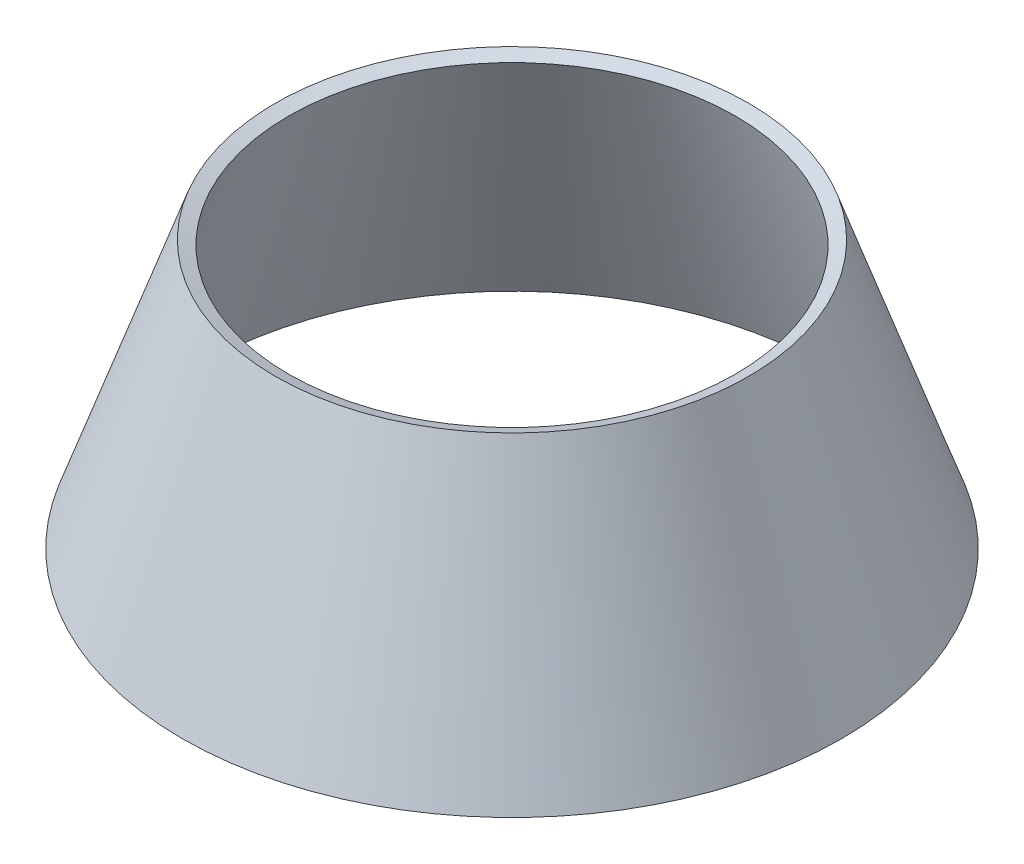
ISO-10303-21;
HEADER;
FILE_DESCRIPTION(('STEP AP214'),'2;1');
FILE_NAME('part.step','',(''),(''),'','','');
FILE_SCHEMA(('AUTOMOTIVE_DESIGN { 1 0 10303 214 1 1 1 1 }'));
ENDSEC;
DATA;
#1=APPLICATION_CONTEXT('core data for automotive mechanical design processes');
#2=APPLICATION_PROTOCOL_DEFINITION('international standard','automotive_design',2000,#1);
#3=PRODUCT_CONTEXT('',#1,'mechanical');
#4=PRODUCT('Part','Part','',(#3));
#5=PRODUCT_RELATED_PRODUCT_CATEGORY('part','',(#4));
#6=PRODUCT_DEFINITION_FORMATION('','',#4);
#7=PRODUCT_DEFINITION_CONTEXT('part definition',#1,'design');
#8=PRODUCT_DEFINITION('design','',#6,#7);
#9=PRODUCT_DEFINITION_SHAPE('','',#8);
#10=(LENGTH_UNIT() NAMED_UNIT(*) SI_UNIT(.MILLI.,.METRE.));
#11=(NAMED_UNIT(*) PLANE_ANGLE_UNIT() SI_UNIT($,.RADIAN.));
#12=(NAMED_UNIT(*) SI_UNIT($,.STERADIAN.) SOLID_ANGLE_UNIT());
#13=UNCERTAINTY_MEASURE_WITH_UNIT(LENGTH_MEASURE(1.E-05),#10,'distance_accuracy_value','');
#14=(GEOMETRIC_REPRESENTATION_CONTEXT(3) GLOBAL_UNCERTAINTY_ASSIGNED_CONTEXT((#13)) GLOBAL_UNIT_ASSIGNED_CONTEXT((#10,
#11,#12)) REPRESENTATION_CONTEXT('',''));
#15=CARTESIAN_POINT('',(0.,0.,0.));
#16=DIRECTION('',(0.,0.,1.));
#17=DIRECTION('',(1.,0.,0.));
#18=AXIS2_PLACEMENT_3D('',#15,#16,#17);
#19=CARTESIAN_POINT('',(0.,-49.1352281724543,41.5));
#20=DIRECTION('',(0.,-1.,0.));
#21=DIRECTION('',(0.,0.,-1.));
#22=AXIS2_PLACEMENT_3D('',#19,#20,#21);
#23=CONICAL_SURFACE('',#22,16.0517969355776,0.335103216382905);
#24=CARTESIAN_POINT('',(0.,-68.0000000000006,41.5));
#25=DIRECTION('',(0.,1.,0.));
#26=DIRECTION('',(0.,0.,1.));
#27=AXIS2_PLACEMENT_3D('',#24,#25,#26);
#28=CIRCLE('',#27,22.62120553996);
#29=CARTESIAN_POINT('',(0.,-68.0000000000006,64.12120553996));
#30=VERTEX_POINT('',#29);
#31=EDGE_CURVE('E45',#30,#30,#28,.T.);
#32=ORIENTED_EDGE('',*,*,#31,.F.);
#33=EDGE_LOOP('',(#32));
#34=FACE_BOUND('',#33,.T.);
#35=CARTESIAN_POINT('',(0.,-49.1352281724543,41.5));
#36=DIRECTION('',(0.,-1.,0.));
#37=DIRECTION('',(0.,0.,-1.));
#38=AXIS2_PLACEMENT_3D('',#35,#36,#37);
#39=CIRCLE('',#38,16.0517969355776);
#40=CARTESIAN_POINT('',(0.,-49.1352281724543,25.4482030644224));
#41=VERTEX_POINT('',#40);
#42=EDGE_CURVE('E10',#41,#41,#39,.T.);
#43=ORIENTED_EDGE('',*,*,#42,.F.);
#44=EDGE_LOOP('',(#43));
#45=FACE_BOUND('',#44,.T.);
#46=ADVANCED_FACE('F31',(#34,#45),#23,.F.);
#47=CARTESIAN_POINT('',(0.,-49.1352281724543,41.5));
#48=DIRECTION('',(0.,1.,0.));
#49=DIRECTION('',(0.,0.,1.));
#50=AXIS2_PLACEMENT_3D('',#47,#48,#49);
#51=CONICAL_SURFACE('',#50,16.0517969355776,1.23569311041199);
#52=CARTESIAN_POINT('',(0.,-48.8063615257157,41.5));
#53=DIRECTION('',(0.,-1.,0.));
#54=DIRECTION('',(0.,0.,-1.));
#55=AXIS2_PLACEMENT_3D('',#52,#53,#54);
#56=CIRCLE('',#55,16.9961733058151);
#57=CARTESIAN_POINT('',(0.,-48.8063615257157,24.5038266941849));
#58=VERTEX_POINT('',#57);
#59=EDGE_CURVE('E37',#58,#58,#56,.T.);
#60=ORIENTED_EDGE('',*,*,#59,.F.);
#61=EDGE_LOOP('',(#60));
#62=FACE_BOUND('',#61,.T.);
#63=ORIENTED_EDGE('',*,*,#42,.T.);
#64=EDGE_LOOP('',(#63));
#65=FACE_BOUND('',#64,.T.);
#66=ADVANCED_FACE('F56',(#62,#65),#51,.F.);
#67=CARTESIAN_POINT('',(0.,-48.8063615257157,41.5));
#68=DIRECTION('',(0.,-1.,0.));
#69=DIRECTION('',(0.,0.,-1.));
#70=AXIS2_PLACEMENT_3D('',#67,#68,#69);
#71=CONICAL_SURFACE('',#70,16.9961733058151,0.335103216382905);
#72=CARTESIAN_POINT('',(0.,-68.0000000000006,41.5));
#73=DIRECTION('',(0.,-1.,0.));
#74=DIRECTION('',(0.,0.,-1.));
#75=AXIS2_PLACEMENT_3D('',#72,#73,#74);
#76=CIRCLE('',#75,23.6801053933611);
#77=CARTESIAN_POINT('',(0.,-68.0000000000006,17.8198946066388));
#78=VERTEX_POINT('',#77);
#79=EDGE_CURVE('E41',#78,#78,#76,.T.);
#80=ORIENTED_EDGE('',*,*,#79,.F.);
#81=EDGE_LOOP('',(#80));
#82=FACE_BOUND('',#81,.T.);
#83=ORIENTED_EDGE('',*,*,#59,.T.);
#84=EDGE_LOOP('',(#83));
#85=FACE_BOUND('',#84,.T.);
#86=ADVANCED_FACE('F60',(#82,#85),#71,.T.);
#87=CARTESIAN_POINT('',(-23.6801053933611,-68.0000000000006,65.1801053933611));
#88=DIRECTION('',(0.,1.,0.));
#89=DIRECTION('',(0.,0.,1.));
#90=AXIS2_PLACEMENT_3D('',#87,#88,#89);
#91=PLANE('',#90);
#92=ORIENTED_EDGE('',*,*,#31,.T.);
#93=EDGE_LOOP('',(#92));
#94=FACE_BOUND('',#93,.T.);
#95=ORIENTED_EDGE('',*,*,#79,.T.);
#96=EDGE_LOOP('',(#95));
#97=FACE_BOUND('',#96,.T.);
#98=ADVANCED_FACE('F51',(#94,#97),#91,.F.);
#99=CLOSED_SHELL('',(#46,#66,#86,#98));
#100=MANIFOLD_SOLID_BREP('B2',#99);
#101=ADVANCED_BREP_SHAPE_REPRESENTATION('',(#18,#100),#14);
#102=SHAPE_DEFINITION_REPRESENTATION(#9,#101);
ENDSEC;
END-ISO-10303-21;
